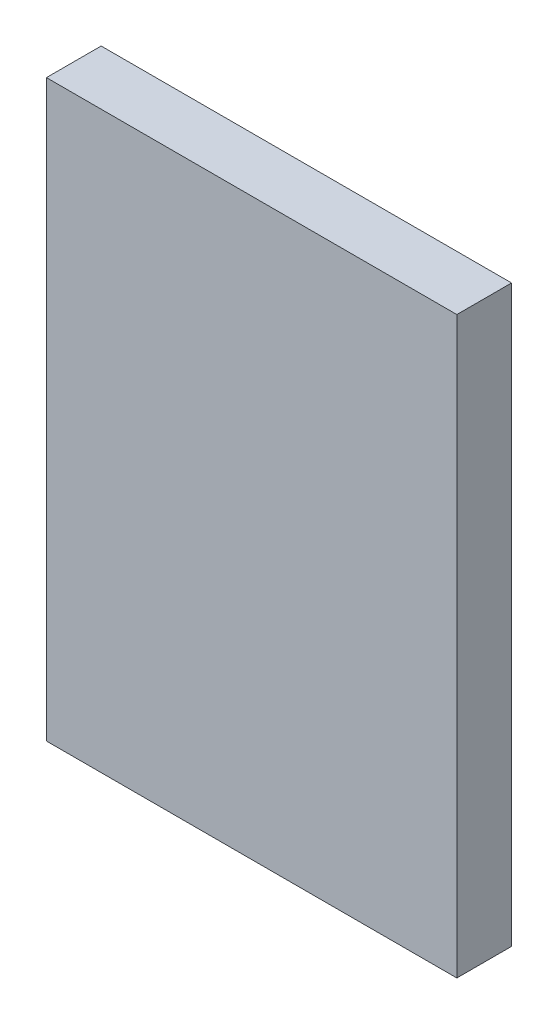
ISO-10303-21;
HEADER;
FILE_DESCRIPTION(('STEP AP214'),'2;1');
FILE_NAME('part.step','',(''),(''),'','','');
FILE_SCHEMA(('AUTOMOTIVE_DESIGN { 1 0 10303 214 1 1 1 1 }'));
ENDSEC;
DATA;
#1=APPLICATION_CONTEXT('core data for automotive mechanical design processes');
#2=APPLICATION_PROTOCOL_DEFINITION('international standard','automotive_design',2000,#1);
#3=PRODUCT_CONTEXT('',#1,'mechanical');
#4=PRODUCT('Part','Part','',(#3));
#5=PRODUCT_RELATED_PRODUCT_CATEGORY('part','',(#4));
#6=PRODUCT_DEFINITION_FORMATION('','',#4);
#7=PRODUCT_DEFINITION_CONTEXT('part definition',#1,'design');
#8=PRODUCT_DEFINITION('design','',#6,#7);
#9=PRODUCT_DEFINITION_SHAPE('','',#8);
#10=(LENGTH_UNIT() NAMED_UNIT(*) SI_UNIT(.MILLI.,.METRE.));
#11=(NAMED_UNIT(*) PLANE_ANGLE_UNIT() SI_UNIT($,.RADIAN.));
#12=(NAMED_UNIT(*) SI_UNIT($,.STERADIAN.) SOLID_ANGLE_UNIT());
#13=UNCERTAINTY_MEASURE_WITH_UNIT(LENGTH_MEASURE(1.E-05),#10,'distance_accuracy_value','');
#14=(GEOMETRIC_REPRESENTATION_CONTEXT(3) GLOBAL_UNCERTAINTY_ASSIGNED_CONTEXT((#13)) GLOBAL_UNIT_ASSIGNED_CONTEXT((#10,
#11,#12)) REPRESENTATION_CONTEXT('',''));
#15=CARTESIAN_POINT('',(0.,0.,0.));
#16=DIRECTION('',(0.,0.,1.));
#17=DIRECTION('',(1.,0.,0.));
#18=AXIS2_PLACEMENT_3D('',#15,#16,#17);
#19=CARTESIAN_POINT('',(0.,0.,4.));
#20=DIRECTION('',(1.,0.,0.));
#21=DIRECTION('',(0.,1.,0.));
#22=AXIS2_PLACEMENT_3D('',#19,#20,#21);
#23=PLANE('',#22);
#24=DIRECTION('',(0.,-1.,0.));
#25=VECTOR('',#24,1.);
#26=CARTESIAN_POINT('',(0.,0.,0.));
#27=LINE('',#26,#25);
#28=CARTESIAN_POINT('',(0.,0.,0.));
#29=VERTEX_POINT('',#28);
#30=CARTESIAN_POINT('',(0.,-42.,0.));
#31=VERTEX_POINT('',#30);
#32=EDGE_CURVE('E113',#29,#31,#27,.T.);
#33=ORIENTED_EDGE('',*,*,#32,.T.);
#34=DIRECTION('',(0.,0.,-1.));
#35=VECTOR('',#34,1.);
#36=CARTESIAN_POINT('',(0.,-42.,4.));
#37=LINE('',#36,#35);
#38=CARTESIAN_POINT('',(0.,-42.,4.));
#39=VERTEX_POINT('',#38);
#40=EDGE_CURVE('E11',#39,#31,#37,.T.);
#41=ORIENTED_EDGE('',*,*,#40,.F.);
#42=DIRECTION('',(0.,-1.,0.));
#43=VECTOR('',#42,1.);
#44=CARTESIAN_POINT('',(0.,0.,4.));
#45=LINE('',#44,#43);
#46=CARTESIAN_POINT('',(0.,0.,4.));
#47=VERTEX_POINT('',#46);
#48=EDGE_CURVE('E97',#47,#39,#45,.T.);
#49=ORIENTED_EDGE('',*,*,#48,.F.);
#50=DIRECTION('',(0.,0.,-1.));
#51=VECTOR('',#50,1.);
#52=CARTESIAN_POINT('',(0.,0.,4.));
#53=LINE('',#52,#51);
#54=EDGE_CURVE('E109',#47,#29,#53,.T.);
#55=ORIENTED_EDGE('',*,*,#54,.T.);
#56=EDGE_LOOP('',(#33,#41,#49,#55));
#57=FACE_BOUND('',#56,.T.);
#58=ADVANCED_FACE('F45',(#57),#23,.F.);
#59=CARTESIAN_POINT('',(0.,-42.,4.));
#60=DIRECTION('',(0.,1.,0.));
#61=DIRECTION('',(0.,0.,1.));
#62=AXIS2_PLACEMENT_3D('',#59,#60,#61);
#63=PLANE('',#62);
#64=DIRECTION('',(1.,0.,0.));
#65=VECTOR('',#64,1.);
#66=CARTESIAN_POINT('',(0.,-42.,0.));
#67=LINE('',#66,#65);
#68=CARTESIAN_POINT('',(30.,-42.,0.));
#69=VERTEX_POINT('',#68);
#70=EDGE_CURVE('E102',#31,#69,#67,.T.);
#71=ORIENTED_EDGE('',*,*,#70,.T.);
#72=DIRECTION('',(0.,0.,-1.));
#73=VECTOR('',#72,1.);
#74=CARTESIAN_POINT('',(30.,-42.,4.));
#75=LINE('',#74,#73);
#76=CARTESIAN_POINT('',(30.,-42.,4.));
#77=VERTEX_POINT('',#76);
#78=EDGE_CURVE('E54',#77,#69,#75,.T.);
#79=ORIENTED_EDGE('',*,*,#78,.F.);
#80=DIRECTION('',(1.,0.,0.));
#81=VECTOR('',#80,1.);
#82=CARTESIAN_POINT('',(0.,-42.,4.));
#83=LINE('',#82,#81);
#84=EDGE_CURVE('E92',#39,#77,#83,.T.);
#85=ORIENTED_EDGE('',*,*,#84,.F.);
#86=ORIENTED_EDGE('',*,*,#40,.T.);
#87=EDGE_LOOP('',(#71,#79,#85,#86));
#88=FACE_BOUND('',#87,.T.);
#89=ADVANCED_FACE('F101',(#88),#63,.F.);
#90=CARTESIAN_POINT('',(30.,0.,4.));
#91=DIRECTION('',(-1.,0.,0.));
#92=DIRECTION('',(0.,-1.,0.));
#93=AXIS2_PLACEMENT_3D('',#90,#91,#92);
#94=PLANE('',#93);
#95=DIRECTION('',(0.,1.,0.));
#96=VECTOR('',#95,1.);
#97=CARTESIAN_POINT('',(30.,0.,0.));
#98=LINE('',#97,#96);
#99=CARTESIAN_POINT('',(30.,0.,0.));
#100=VERTEX_POINT('',#99);
#101=EDGE_CURVE('E79',#69,#100,#98,.T.);
#102=ORIENTED_EDGE('',*,*,#101,.T.);
#103=DIRECTION('',(0.,0.,-1.));
#104=VECTOR('',#103,1.);
#105=CARTESIAN_POINT('',(30.,0.,4.));
#106=LINE('',#105,#104);
#107=CARTESIAN_POINT('',(30.,0.,4.));
#108=VERTEX_POINT('',#107);
#109=EDGE_CURVE('E104',#108,#100,#106,.T.);
#110=ORIENTED_EDGE('',*,*,#109,.F.);
#111=DIRECTION('',(0.,1.,0.));
#112=VECTOR('',#111,1.);
#113=CARTESIAN_POINT('',(30.,0.,4.));
#114=LINE('',#113,#112);
#115=EDGE_CURVE('E95',#77,#108,#114,.T.);
#116=ORIENTED_EDGE('',*,*,#115,.F.);
#117=ORIENTED_EDGE('',*,*,#78,.T.);
#118=EDGE_LOOP('',(#102,#110,#116,#117));
#119=FACE_BOUND('',#118,.T.);
#120=ADVANCED_FACE('F105',(#119),#94,.F.);
#121=CARTESIAN_POINT('',(0.,0.,4.));
#122=DIRECTION('',(0.,-1.,0.));
#123=DIRECTION('',(0.,0.,-1.));
#124=AXIS2_PLACEMENT_3D('',#121,#122,#123);
#125=PLANE('',#124);
#126=DIRECTION('',(-1.,0.,0.));
#127=VECTOR('',#126,1.);
#128=CARTESIAN_POINT('',(0.,0.,0.));
#129=LINE('',#128,#127);
#130=EDGE_CURVE('E85',#100,#29,#129,.T.);
#131=ORIENTED_EDGE('',*,*,#130,.T.);
#132=ORIENTED_EDGE('',*,*,#54,.F.);
#133=DIRECTION('',(-1.,0.,0.));
#134=VECTOR('',#133,1.);
#135=CARTESIAN_POINT('',(0.,0.,4.));
#136=LINE('',#135,#134);
#137=EDGE_CURVE('E62',#108,#47,#136,.T.);
#138=ORIENTED_EDGE('',*,*,#137,.F.);
#139=ORIENTED_EDGE('',*,*,#109,.T.);
#140=EDGE_LOOP('',(#131,#132,#138,#139));
#141=FACE_BOUND('',#140,.T.);
#142=ADVANCED_FACE('F126',(#141),#125,.F.);
#143=CARTESIAN_POINT('',(0.,0.,4.));
#144=DIRECTION('',(0.,0.,1.));
#145=DIRECTION('',(1.,0.,0.));
#146=AXIS2_PLACEMENT_3D('',#143,#144,#145);
#147=PLANE('',#146);
#148=ORIENTED_EDGE('',*,*,#48,.T.);
#149=ORIENTED_EDGE('',*,*,#84,.T.);
#150=ORIENTED_EDGE('',*,*,#115,.T.);
#151=ORIENTED_EDGE('',*,*,#137,.T.);
#152=EDGE_LOOP('',(#148,#149,#150,#151));
#153=FACE_BOUND('',#152,.T.);
#154=ADVANCED_FACE('F93',(#153),#147,.T.);
#155=CARTESIAN_POINT('',(0.,0.,0.));
#156=DIRECTION('',(0.,0.,1.));
#157=DIRECTION('',(1.,0.,0.));
#158=AXIS2_PLACEMENT_3D('',#155,#156,#157);
#159=PLANE('',#158);
#160=ORIENTED_EDGE('',*,*,#32,.F.);
#161=ORIENTED_EDGE('',*,*,#130,.F.);
#162=ORIENTED_EDGE('',*,*,#101,.F.);
#163=ORIENTED_EDGE('',*,*,#70,.F.);
#164=EDGE_LOOP('',(#160,#161,#162,#163));
#165=FACE_BOUND('',#164,.T.);
#166=ADVANCED_FACE('F129',(#165),#159,.F.);
#167=CLOSED_SHELL('',(#58,#89,#120,#142,#154,#166));
#168=MANIFOLD_SOLID_BREP('B2',#167);
#169=ADVANCED_BREP_SHAPE_REPRESENTATION('',(#18,#168),#14);
#170=SHAPE_DEFINITION_REPRESENTATION(#9,#169);
ENDSEC;
END-ISO-10303-21;
